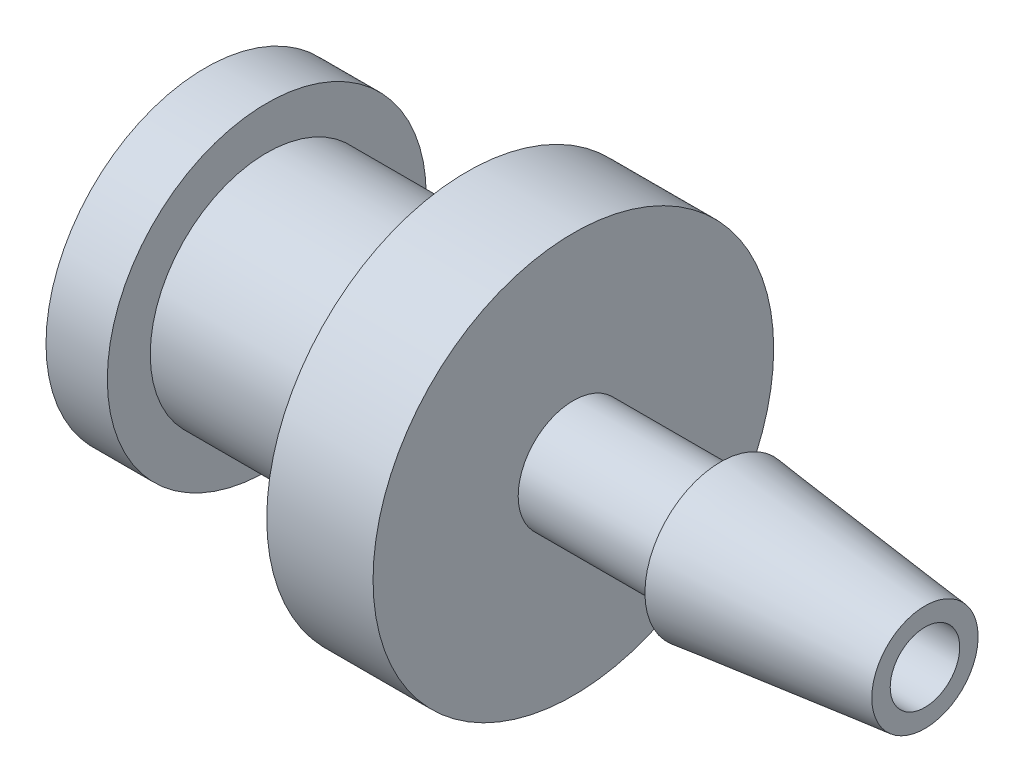
ISO-10303-21;
HEADER;
FILE_DESCRIPTION(('STEP AP214'),'2;1');
FILE_NAME('part.step','',(''),(''),'','','');
FILE_SCHEMA(('AUTOMOTIVE_DESIGN { 1 0 10303 214 1 1 1 1 }'));
ENDSEC;
DATA;
#1=APPLICATION_CONTEXT('core data for automotive mechanical design processes');
#2=APPLICATION_PROTOCOL_DEFINITION('international standard','automotive_design',2000,#1);
#3=PRODUCT_CONTEXT('',#1,'mechanical');
#4=PRODUCT('Part','Part','',(#3));
#5=PRODUCT_RELATED_PRODUCT_CATEGORY('part','',(#4));
#6=PRODUCT_DEFINITION_FORMATION('','',#4);
#7=PRODUCT_DEFINITION_CONTEXT('part definition',#1,'design');
#8=PRODUCT_DEFINITION('design','',#6,#7);
#9=PRODUCT_DEFINITION_SHAPE('','',#8);
#10=(LENGTH_UNIT() NAMED_UNIT(*) SI_UNIT(.MILLI.,.METRE.));
#11=(NAMED_UNIT(*) PLANE_ANGLE_UNIT() SI_UNIT($,.RADIAN.));
#12=(NAMED_UNIT(*) SI_UNIT($,.STERADIAN.) SOLID_ANGLE_UNIT());
#13=UNCERTAINTY_MEASURE_WITH_UNIT(LENGTH_MEASURE(1.E-05),#10,'distance_accuracy_value','');
#14=(GEOMETRIC_REPRESENTATION_CONTEXT(3) GLOBAL_UNCERTAINTY_ASSIGNED_CONTEXT((#13)) GLOBAL_UNIT_ASSIGNED_CONTEXT((#10,
#11,#12)) REPRESENTATION_CONTEXT('',''));
#15=CARTESIAN_POINT('',(0.,0.,0.));
#16=DIRECTION('',(0.,0.,1.));
#17=DIRECTION('',(1.,0.,0.));
#18=AXIS2_PLACEMENT_3D('',#15,#16,#17);
#19=CARTESIAN_POINT('',(7.90743801652892,0.,0.));
#20=DIRECTION('',(1.,0.,0.));
#21=DIRECTION('',(0.,0.,-1.));
#22=AXIS2_PLACEMENT_3D('',#19,#20,#21);
#23=PLANE('',#22);
#24=CARTESIAN_POINT('',(7.90743801652892,0.,0.));
#25=DIRECTION('',(-1.,0.,0.));
#26=DIRECTION('',(0.,0.,1.));
#27=AXIS2_PLACEMENT_3D('',#24,#25,#26);
#28=CIRCLE('',#27,0.85);
#29=CARTESIAN_POINT('',(7.90743801652892,0.,0.85));
#30=VERTEX_POINT('',#29);
#31=EDGE_CURVE('E10',#30,#30,#28,.T.);
#32=ORIENTED_EDGE('',*,*,#31,.F.);
#33=EDGE_LOOP('',(#32));
#34=FACE_BOUND('',#33,.T.);
#35=CARTESIAN_POINT('',(7.90743801652892,0.,0.));
#36=DIRECTION('',(-1.,0.,0.));
#37=DIRECTION('',(0.,0.,1.));
#38=AXIS2_PLACEMENT_3D('',#35,#36,#37);
#39=CIRCLE('',#38,2.05);
#40=CARTESIAN_POINT('',(7.90743801652892,0.,2.05));
#41=VERTEX_POINT('',#40);
#42=EDGE_CURVE('E100',#41,#41,#39,.T.);
#43=ORIENTED_EDGE('',*,*,#42,.T.);
#44=EDGE_LOOP('',(#43));
#45=FACE_BOUND('',#44,.T.);
#46=ADVANCED_FACE('F41',(#34,#45),#23,.F.);
#47=CARTESIAN_POINT('',(-7.16528925619834,0.,0.));
#48=DIRECTION('',(-1.,0.,0.));
#49=DIRECTION('',(0.,0.,1.));
#50=AXIS2_PLACEMENT_3D('',#47,#48,#49);
#51=CYLINDRICAL_SURFACE('',#50,0.85);
#52=CARTESIAN_POINT('',(17.3074380165289,0.,0.));
#53=DIRECTION('',(-1.,0.,0.));
#54=DIRECTION('',(0.,0.,1.));
#55=AXIS2_PLACEMENT_3D('',#52,#53,#54);
#56=CIRCLE('',#55,0.85);
#57=CARTESIAN_POINT('',(17.3074380165289,0.,0.85));
#58=VERTEX_POINT('',#57);
#59=EDGE_CURVE('E48',#58,#58,#56,.T.);
#60=ORIENTED_EDGE('',*,*,#59,.F.);
#61=EDGE_LOOP('',(#60));
#62=FACE_BOUND('',#61,.T.);
#63=ORIENTED_EDGE('',*,*,#31,.T.);
#64=EDGE_LOOP('',(#63));
#65=FACE_BOUND('',#64,.T.);
#66=ADVANCED_FACE('F174',(#62,#65),#51,.F.);
#67=CARTESIAN_POINT('',(17.3074380165289,0.,0.));
#68=DIRECTION('',(-1.,0.,0.));
#69=DIRECTION('',(0.,0.,1.));
#70=AXIS2_PLACEMENT_3D('',#67,#68,#69);
#71=PLANE('',#70);
#72=CARTESIAN_POINT('',(17.3074380165289,0.,0.));
#73=DIRECTION('',(-1.,0.,0.));
#74=DIRECTION('',(0.,0.,1.));
#75=AXIS2_PLACEMENT_3D('',#72,#73,#74);
#76=CIRCLE('',#75,1.3);
#77=CARTESIAN_POINT('',(17.3074380165289,0.,1.3));
#78=VERTEX_POINT('',#77);
#79=EDGE_CURVE('E53',#78,#78,#76,.T.);
#80=ORIENTED_EDGE('',*,*,#79,.F.);
#81=EDGE_LOOP('',(#80));
#82=FACE_BOUND('',#81,.T.);
#83=ORIENTED_EDGE('',*,*,#59,.T.);
#84=EDGE_LOOP('',(#83));
#85=FACE_BOUND('',#84,.T.);
#86=ADVANCED_FACE('F169',(#82,#85),#71,.F.);
#87=CARTESIAN_POINT('',(17.3074380165289,0.,0.));
#88=DIRECTION('',(-1.,0.,0.));
#89=DIRECTION('',(0.,0.,1.));
#90=AXIS2_PLACEMENT_3D('',#87,#88,#89);
#91=CONICAL_SURFACE('',#90,1.3,0.109559526773944);
#92=CARTESIAN_POINT('',(12.3074380165289,0.,0.));
#93=DIRECTION('',(-1.,0.,0.));
#94=DIRECTION('',(0.,0.,1.));
#95=AXIS2_PLACEMENT_3D('',#92,#93,#94);
#96=CIRCLE('',#95,1.85);
#97=CARTESIAN_POINT('',(12.3074380165289,0.,1.85));
#98=VERTEX_POINT('',#97);
#99=EDGE_CURVE('E58',#98,#98,#96,.T.);
#100=ORIENTED_EDGE('',*,*,#99,.F.);
#101=EDGE_LOOP('',(#100));
#102=FACE_BOUND('',#101,.T.);
#103=ORIENTED_EDGE('',*,*,#79,.T.);
#104=EDGE_LOOP('',(#103));
#105=FACE_BOUND('',#104,.T.);
#106=ADVANCED_FACE('F163',(#102,#105),#91,.T.);
#107=CARTESIAN_POINT('',(12.3074380165289,0.,0.));
#108=DIRECTION('',(1.,0.,0.));
#109=DIRECTION('',(0.,0.,-1.));
#110=AXIS2_PLACEMENT_3D('',#107,#108,#109);
#111=PLANE('',#110);
#112=CARTESIAN_POINT('',(12.3074380165289,0.,0.));
#113=DIRECTION('',(-1.,0.,0.));
#114=DIRECTION('',(0.,0.,1.));
#115=AXIS2_PLACEMENT_3D('',#112,#113,#114);
#116=CIRCLE('',#115,1.35);
#117=CARTESIAN_POINT('',(12.3074380165289,0.,1.35));
#118=VERTEX_POINT('',#117);
#119=EDGE_CURVE('E64',#118,#118,#116,.T.);
#120=ORIENTED_EDGE('',*,*,#119,.F.);
#121=EDGE_LOOP('',(#120));
#122=FACE_BOUND('',#121,.T.);
#123=ORIENTED_EDGE('',*,*,#99,.T.);
#124=EDGE_LOOP('',(#123));
#125=FACE_BOUND('',#124,.T.);
#126=ADVANCED_FACE('F157',(#122,#125),#111,.F.);
#127=CARTESIAN_POINT('',(-7.16528925619834,0.,0.));
#128=DIRECTION('',(-1.,0.,0.));
#129=DIRECTION('',(0.,0.,1.));
#130=AXIS2_PLACEMENT_3D('',#127,#128,#129);
#131=CYLINDRICAL_SURFACE('',#130,1.35);
#132=CARTESIAN_POINT('',(8.70743801652892,0.,0.));
#133=DIRECTION('',(-1.,0.,0.));
#134=DIRECTION('',(0.,0.,1.));
#135=AXIS2_PLACEMENT_3D('',#132,#133,#134);
#136=CIRCLE('',#135,1.35);
#137=CARTESIAN_POINT('',(8.70743801652892,0.,1.35));
#138=VERTEX_POINT('',#137);
#139=EDGE_CURVE('E68',#138,#138,#136,.T.);
#140=ORIENTED_EDGE('',*,*,#139,.F.);
#141=EDGE_LOOP('',(#140));
#142=FACE_BOUND('',#141,.T.);
#143=ORIENTED_EDGE('',*,*,#119,.T.);
#144=EDGE_LOOP('',(#143));
#145=FACE_BOUND('',#144,.T.);
#146=ADVANCED_FACE('F151',(#142,#145),#131,.T.);
#147=CARTESIAN_POINT('',(8.70743801652892,0.,0.));
#148=DIRECTION('',(-1.,0.,0.));
#149=DIRECTION('',(0.,0.,1.));
#150=AXIS2_PLACEMENT_3D('',#147,#148,#149);
#151=PLANE('',#150);
#152=CARTESIAN_POINT('',(8.70743801652892,0.,0.));
#153=DIRECTION('',(-1.,0.,0.));
#154=DIRECTION('',(0.,0.,1.));
#155=AXIS2_PLACEMENT_3D('',#152,#153,#154);
#156=CIRCLE('',#155,4.9);
#157=CARTESIAN_POINT('',(8.70743801652892,0.,4.9));
#158=VERTEX_POINT('',#157);
#159=EDGE_CURVE('E72',#158,#158,#156,.T.);
#160=ORIENTED_EDGE('',*,*,#159,.F.);
#161=EDGE_LOOP('',(#160));
#162=FACE_BOUND('',#161,.T.);
#163=ORIENTED_EDGE('',*,*,#139,.T.);
#164=EDGE_LOOP('',(#163));
#165=FACE_BOUND('',#164,.T.);
#166=ADVANCED_FACE('F145',(#162,#165),#151,.F.);
#167=CARTESIAN_POINT('',(-7.16528925619834,0.,0.));
#168=DIRECTION('',(-1.,0.,0.));
#169=DIRECTION('',(0.,0.,1.));
#170=AXIS2_PLACEMENT_3D('',#167,#168,#169);
#171=CYLINDRICAL_SURFACE('',#170,4.9);
#172=CARTESIAN_POINT('',(6.10743801652892,0.,0.));
#173=DIRECTION('',(-1.,0.,0.));
#174=DIRECTION('',(0.,0.,1.));
#175=AXIS2_PLACEMENT_3D('',#172,#173,#174);
#176=CIRCLE('',#175,4.9);
#177=CARTESIAN_POINT('',(6.10743801652892,0.,4.9));
#178=VERTEX_POINT('',#177);
#179=EDGE_CURVE('E76',#178,#178,#176,.T.);
#180=ORIENTED_EDGE('',*,*,#179,.F.);
#181=EDGE_LOOP('',(#180));
#182=FACE_BOUND('',#181,.T.);
#183=ORIENTED_EDGE('',*,*,#159,.T.);
#184=EDGE_LOOP('',(#183));
#185=FACE_BOUND('',#184,.T.);
#186=ADVANCED_FACE('F139',(#182,#185),#171,.T.);
#187=CARTESIAN_POINT('',(6.10743801652892,0.,0.));
#188=DIRECTION('',(1.,0.,0.));
#189=DIRECTION('',(0.,0.,-1.));
#190=AXIS2_PLACEMENT_3D('',#187,#188,#189);
#191=PLANE('',#190);
#192=CARTESIAN_POINT('',(6.10743801652892,0.,0.));
#193=DIRECTION('',(-1.,0.,0.));
#194=DIRECTION('',(0.,0.,1.));
#195=AXIS2_PLACEMENT_3D('',#192,#193,#194);
#196=CIRCLE('',#195,2.85);
#197=CARTESIAN_POINT('',(6.10743801652892,0.,2.85));
#198=VERTEX_POINT('',#197);
#199=EDGE_CURVE('E80',#198,#198,#196,.T.);
#200=ORIENTED_EDGE('',*,*,#199,.F.);
#201=EDGE_LOOP('',(#200));
#202=FACE_BOUND('',#201,.T.);
#203=ORIENTED_EDGE('',*,*,#179,.T.);
#204=EDGE_LOOP('',(#203));
#205=FACE_BOUND('',#204,.T.);
#206=ADVANCED_FACE('F133',(#202,#205),#191,.F.);
#207=CARTESIAN_POINT('',(-7.16528925619834,0.,0.));
#208=DIRECTION('',(-1.,0.,0.));
#209=DIRECTION('',(0.,0.,1.));
#210=AXIS2_PLACEMENT_3D('',#207,#208,#209);
#211=CYLINDRICAL_SURFACE('',#210,2.85);
#212=CARTESIAN_POINT('',(1.20743801652892,0.,0.));
#213=DIRECTION('',(-1.,0.,0.));
#214=DIRECTION('',(0.,0.,1.));
#215=AXIS2_PLACEMENT_3D('',#212,#213,#214);
#216=CIRCLE('',#215,2.85);
#217=CARTESIAN_POINT('',(1.20743801652892,0.,2.85));
#218=VERTEX_POINT('',#217);
#219=EDGE_CURVE('E84',#218,#218,#216,.T.);
#220=ORIENTED_EDGE('',*,*,#219,.F.);
#221=EDGE_LOOP('',(#220));
#222=FACE_BOUND('',#221,.T.);
#223=ORIENTED_EDGE('',*,*,#199,.T.);
#224=EDGE_LOOP('',(#223));
#225=FACE_BOUND('',#224,.T.);
#226=ADVANCED_FACE('F127',(#222,#225),#211,.T.);
#227=CARTESIAN_POINT('',(1.20743801652892,0.,0.));
#228=DIRECTION('',(-1.,0.,0.));
#229=DIRECTION('',(0.,0.,1.));
#230=AXIS2_PLACEMENT_3D('',#227,#228,#229);
#231=PLANE('',#230);
#232=CARTESIAN_POINT('',(1.20743801652892,0.,0.));
#233=DIRECTION('',(-1.,0.,0.));
#234=DIRECTION('',(0.,0.,1.));
#235=AXIS2_PLACEMENT_3D('',#232,#233,#234);
#236=CIRCLE('',#235,3.9);
#237=CARTESIAN_POINT('',(1.20743801652892,0.,3.9));
#238=VERTEX_POINT('',#237);
#239=EDGE_CURVE('E88',#238,#238,#236,.T.);
#240=ORIENTED_EDGE('',*,*,#239,.F.);
#241=EDGE_LOOP('',(#240));
#242=FACE_BOUND('',#241,.T.);
#243=ORIENTED_EDGE('',*,*,#219,.T.);
#244=EDGE_LOOP('',(#243));
#245=FACE_BOUND('',#244,.T.);
#246=ADVANCED_FACE('F121',(#242,#245),#231,.F.);
#247=CARTESIAN_POINT('',(-7.16528925619834,0.,0.));
#248=DIRECTION('',(-1.,0.,0.));
#249=DIRECTION('',(0.,0.,1.));
#250=AXIS2_PLACEMENT_3D('',#247,#248,#249);
#251=CYLINDRICAL_SURFACE('',#250,3.9);
#252=CARTESIAN_POINT('',(-0.292561983471083,0.,0.));
#253=DIRECTION('',(-1.,0.,0.));
#254=DIRECTION('',(0.,0.,1.));
#255=AXIS2_PLACEMENT_3D('',#252,#253,#254);
#256=CIRCLE('',#255,3.9);
#257=CARTESIAN_POINT('',(-0.292561983471083,0.,3.9));
#258=VERTEX_POINT('',#257);
#259=EDGE_CURVE('E92',#258,#258,#256,.T.);
#260=ORIENTED_EDGE('',*,*,#259,.F.);
#261=EDGE_LOOP('',(#260));
#262=FACE_BOUND('',#261,.T.);
#263=ORIENTED_EDGE('',*,*,#239,.T.);
#264=EDGE_LOOP('',(#263));
#265=FACE_BOUND('',#264,.T.);
#266=ADVANCED_FACE('F115',(#262,#265),#251,.T.);
#267=CARTESIAN_POINT('',(-0.292561983471082,0.,0.));
#268=DIRECTION('',(1.,0.,0.));
#269=DIRECTION('',(0.,0.,-1.));
#270=AXIS2_PLACEMENT_3D('',#267,#268,#269);
#271=PLANE('',#270);
#272=CARTESIAN_POINT('',(-0.292561983471082,0.,0.));
#273=DIRECTION('',(-1.,0.,0.));
#274=DIRECTION('',(0.,0.,1.));
#275=AXIS2_PLACEMENT_3D('',#272,#273,#274);
#276=CIRCLE('',#275,2.05);
#277=CARTESIAN_POINT('',(-0.292561983471082,0.,2.05));
#278=VERTEX_POINT('',#277);
#279=EDGE_CURVE('E96',#278,#278,#276,.T.);
#280=ORIENTED_EDGE('',*,*,#279,.F.);
#281=EDGE_LOOP('',(#280));
#282=FACE_BOUND('',#281,.T.);
#283=ORIENTED_EDGE('',*,*,#259,.T.);
#284=EDGE_LOOP('',(#283));
#285=FACE_BOUND('',#284,.T.);
#286=ADVANCED_FACE('F109',(#282,#285),#271,.F.);
#287=CARTESIAN_POINT('',(-7.16528925619834,0.,0.));
#288=DIRECTION('',(-1.,0.,0.));
#289=DIRECTION('',(0.,0.,1.));
#290=AXIS2_PLACEMENT_3D('',#287,#288,#289);
#291=CYLINDRICAL_SURFACE('',#290,2.05);
#292=ORIENTED_EDGE('',*,*,#42,.F.);
#293=EDGE_LOOP('',(#292));
#294=FACE_BOUND('',#293,.T.);
#295=ORIENTED_EDGE('',*,*,#279,.T.);
#296=EDGE_LOOP('',(#295));
#297=FACE_BOUND('',#296,.T.);
#298=ADVANCED_FACE('F106',(#294,#297),#291,.F.);
#299=CLOSED_SHELL('',(#46,#66,#86,#106,#126,#146,#166,#186,#206,#226,#246,#266,#286,#298));
#300=MANIFOLD_SOLID_BREP('B2',#299);
#301=ADVANCED_BREP_SHAPE_REPRESENTATION('',(#18,#300),#14);
#302=SHAPE_DEFINITION_REPRESENTATION(#9,#301);
ENDSEC;
END-ISO-10303-21;
